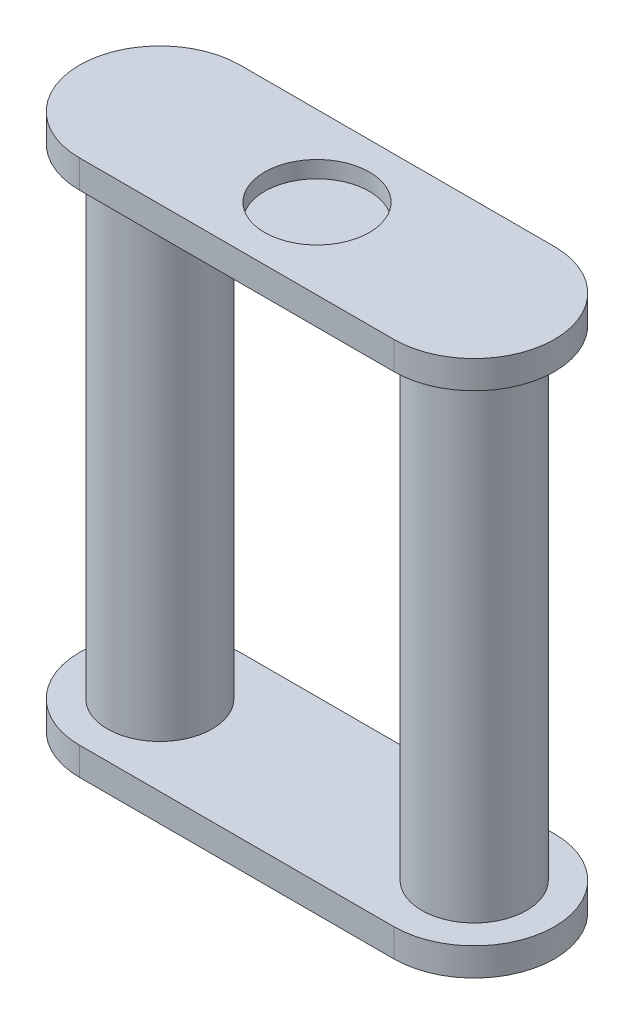
ISO-10303-21;
HEADER;
FILE_DESCRIPTION(('STEP AP214'),'2;1');
FILE_NAME('part.step','',(''),(''),'','','');
FILE_SCHEMA(('AUTOMOTIVE_DESIGN { 1 0 10303 214 1 1 1 1 }'));
ENDSEC;
DATA;
#1=APPLICATION_CONTEXT('core data for automotive mechanical design processes');
#2=APPLICATION_PROTOCOL_DEFINITION('international standard','automotive_design',2000,#1);
#3=PRODUCT_CONTEXT('',#1,'mechanical');
#4=PRODUCT('Part','Part','',(#3));
#5=PRODUCT_RELATED_PRODUCT_CATEGORY('part','',(#4));
#6=PRODUCT_DEFINITION_FORMATION('','',#4);
#7=PRODUCT_DEFINITION_CONTEXT('part definition',#1,'design');
#8=PRODUCT_DEFINITION('design','',#6,#7);
#9=PRODUCT_DEFINITION_SHAPE('','',#8);
#10=(LENGTH_UNIT() NAMED_UNIT(*) SI_UNIT(.MILLI.,.METRE.));
#11=(NAMED_UNIT(*) PLANE_ANGLE_UNIT() SI_UNIT($,.RADIAN.));
#12=(NAMED_UNIT(*) SI_UNIT($,.STERADIAN.) SOLID_ANGLE_UNIT());
#13=UNCERTAINTY_MEASURE_WITH_UNIT(LENGTH_MEASURE(1.E-05),#10,'distance_accuracy_value','');
#14=(GEOMETRIC_REPRESENTATION_CONTEXT(3) GLOBAL_UNCERTAINTY_ASSIGNED_CONTEXT((#13)) GLOBAL_UNIT_ASSIGNED_CONTEXT((#10,
#11,#12)) REPRESENTATION_CONTEXT('',''));
#15=CARTESIAN_POINT('',(0.,0.,0.));
#16=DIRECTION('',(0.,0.,1.));
#17=DIRECTION('',(1.,0.,0.));
#18=AXIS2_PLACEMENT_3D('',#15,#16,#17);
#19=CARTESIAN_POINT('',(0.,40.,-115.));
#20=DIRECTION('',(0.,-1.,0.));
#21=DIRECTION('',(0.,0.,-1.));
#22=AXIS2_PLACEMENT_3D('',#19,#20,#21);
#23=CYLINDRICAL_SURFACE('',#22,115.);
#24=CARTESIAN_POINT('',(0.,0.,-115.));
#25=DIRECTION('',(0.,1.,0.));
#26=DIRECTION('',(0.,0.,1.));
#27=AXIS2_PLACEMENT_3D('',#24,#25,#26);
#28=CIRCLE('',#27,115.);
#29=CARTESIAN_POINT('',(0.,0.,-230.));
#30=VERTEX_POINT('',#29);
#31=CARTESIAN_POINT('',(0.,0.,0.));
#32=VERTEX_POINT('',#31);
#33=EDGE_CURVE('E165',#30,#32,#28,.T.);
#34=ORIENTED_EDGE('',*,*,#33,.T.);
#35=DIRECTION('',(0.,-1.,0.));
#36=VECTOR('',#35,1.);
#37=CARTESIAN_POINT('',(0.,40.,0.));
#38=LINE('',#37,#36);
#39=CARTESIAN_POINT('',(0.,40.,0.));
#40=VERTEX_POINT('',#39);
#41=EDGE_CURVE('E11',#40,#32,#38,.T.);
#42=ORIENTED_EDGE('',*,*,#41,.F.);
#43=CARTESIAN_POINT('',(0.,40.,-115.));
#44=DIRECTION('',(0.,1.,0.));
#45=DIRECTION('',(0.,0.,1.));
#46=AXIS2_PLACEMENT_3D('',#43,#44,#45);
#47=CIRCLE('',#46,115.);
#48=CARTESIAN_POINT('',(0.,40.,-230.));
#49=VERTEX_POINT('',#48);
#50=EDGE_CURVE('E168',#49,#40,#47,.T.);
#51=ORIENTED_EDGE('',*,*,#50,.F.);
#52=DIRECTION('',(0.,-1.,0.));
#53=VECTOR('',#52,1.);
#54=CARTESIAN_POINT('',(0.,40.,-230.));
#55=LINE('',#54,#53);
#56=EDGE_CURVE('E174',#49,#30,#55,.T.);
#57=ORIENTED_EDGE('',*,*,#56,.T.);
#58=EDGE_LOOP('',(#34,#42,#51,#57));
#59=FACE_BOUND('',#58,.T.);
#60=ADVANCED_FACE('F37',(#59),#23,.T.);
#61=CARTESIAN_POINT('',(0.,40.,0.));
#62=DIRECTION('',(0.,0.,-1.));
#63=DIRECTION('',(-1.,0.,0.));
#64=AXIS2_PLACEMENT_3D('',#61,#62,#63);
#65=PLANE('',#64);
#66=DIRECTION('',(1.,0.,0.));
#67=VECTOR('',#66,1.);
#68=CARTESIAN_POINT('',(0.,0.,0.));
#69=LINE('',#68,#67);
#70=CARTESIAN_POINT('',(450.,0.,0.));
#71=VERTEX_POINT('',#70);
#72=EDGE_CURVE('E177',#32,#71,#69,.T.);
#73=ORIENTED_EDGE('',*,*,#72,.T.);
#74=DIRECTION('',(0.,-1.,0.));
#75=VECTOR('',#74,1.);
#76=CARTESIAN_POINT('',(450.,40.,0.));
#77=LINE('',#76,#75);
#78=CARTESIAN_POINT('',(450.,40.,0.));
#79=VERTEX_POINT('',#78);
#80=EDGE_CURVE('E45',#79,#71,#77,.T.);
#81=ORIENTED_EDGE('',*,*,#80,.F.);
#82=DIRECTION('',(1.,0.,0.));
#83=VECTOR('',#82,1.);
#84=CARTESIAN_POINT('',(0.,40.,0.));
#85=LINE('',#84,#83);
#86=EDGE_CURVE('E84',#40,#79,#85,.T.);
#87=ORIENTED_EDGE('',*,*,#86,.F.);
#88=ORIENTED_EDGE('',*,*,#41,.T.);
#89=EDGE_LOOP('',(#73,#81,#87,#88));
#90=FACE_BOUND('',#89,.T.);
#91=ADVANCED_FACE('F201',(#90),#65,.F.);
#92=CARTESIAN_POINT('',(450.,40.,-115.));
#93=DIRECTION('',(0.,-1.,0.));
#94=DIRECTION('',(0.,0.,-1.));
#95=AXIS2_PLACEMENT_3D('',#92,#93,#94);
#96=CYLINDRICAL_SURFACE('',#95,115.);
#97=CARTESIAN_POINT('',(450.,0.,-115.));
#98=DIRECTION('',(0.,1.,0.));
#99=DIRECTION('',(0.,0.,1.));
#100=AXIS2_PLACEMENT_3D('',#97,#98,#99);
#101=CIRCLE('',#100,115.);
#102=CARTESIAN_POINT('',(450.,0.,-230.));
#103=VERTEX_POINT('',#102);
#104=EDGE_CURVE('E71',#71,#103,#101,.T.);
#105=ORIENTED_EDGE('',*,*,#104,.T.);
#106=DIRECTION('',(0.,-1.,0.));
#107=VECTOR('',#106,1.);
#108=CARTESIAN_POINT('',(450.,40.,-230.));
#109=LINE('',#108,#107);
#110=CARTESIAN_POINT('',(450.,40.,-230.));
#111=VERTEX_POINT('',#110);
#112=EDGE_CURVE('E182',#111,#103,#109,.T.);
#113=ORIENTED_EDGE('',*,*,#112,.F.);
#114=CARTESIAN_POINT('',(450.,40.,-115.));
#115=DIRECTION('',(0.,1.,0.));
#116=DIRECTION('',(0.,0.,1.));
#117=AXIS2_PLACEMENT_3D('',#114,#115,#116);
#118=CIRCLE('',#117,115.);
#119=EDGE_CURVE('E171',#79,#111,#118,.T.);
#120=ORIENTED_EDGE('',*,*,#119,.F.);
#121=ORIENTED_EDGE('',*,*,#80,.T.);
#122=EDGE_LOOP('',(#105,#113,#120,#121));
#123=FACE_BOUND('',#122,.T.);
#124=ADVANCED_FACE('F184',(#123),#96,.T.);
#125=CARTESIAN_POINT('',(0.,40.,-230.));
#126=DIRECTION('',(0.,0.,1.));
#127=DIRECTION('',(1.,0.,0.));
#128=AXIS2_PLACEMENT_3D('',#125,#126,#127);
#129=PLANE('',#128);
#130=DIRECTION('',(-1.,0.,0.));
#131=VECTOR('',#130,1.);
#132=CARTESIAN_POINT('',(0.,0.,-230.));
#133=LINE('',#132,#131);
#134=EDGE_CURVE('E77',#103,#30,#133,.T.);
#135=ORIENTED_EDGE('',*,*,#134,.T.);
#136=ORIENTED_EDGE('',*,*,#56,.F.);
#137=DIRECTION('',(-1.,0.,0.));
#138=VECTOR('',#137,1.);
#139=CARTESIAN_POINT('',(0.,40.,-230.));
#140=LINE('',#139,#138);
#141=EDGE_CURVE('E53',#111,#49,#140,.T.);
#142=ORIENTED_EDGE('',*,*,#141,.F.);
#143=ORIENTED_EDGE('',*,*,#112,.T.);
#144=EDGE_LOOP('',(#135,#136,#142,#143));
#145=FACE_BOUND('',#144,.T.);
#146=ADVANCED_FACE('F191',(#145),#129,.F.);
#147=CARTESIAN_POINT('',(0.,40.,-115.));
#148=DIRECTION('',(0.,1.,0.));
#149=DIRECTION('',(0.,0.,1.));
#150=AXIS2_PLACEMENT_3D('',#147,#148,#149);
#151=PLANE('',#150);
#152=CARTESIAN_POINT('',(450.,40.,-115.));
#153=DIRECTION('',(0.,1.,0.));
#154=DIRECTION('',(0.,0.,1.));
#155=AXIS2_PLACEMENT_3D('',#152,#153,#154);
#156=CIRCLE('',#155,75.);
#157=CARTESIAN_POINT('',(450.,40.,-40.));
#158=VERTEX_POINT('',#157);
#159=EDGE_CURVE('E122',#158,#158,#156,.T.);
#160=ORIENTED_EDGE('',*,*,#159,.F.);
#161=EDGE_LOOP('',(#160));
#162=FACE_BOUND('',#161,.T.);
#163=CARTESIAN_POINT('',(0.,40.,-115.));
#164=DIRECTION('',(0.,1.,0.));
#165=DIRECTION('',(0.,0.,1.));
#166=AXIS2_PLACEMENT_3D('',#163,#164,#165);
#167=CIRCLE('',#166,75.);
#168=CARTESIAN_POINT('',(0.,40.,-40.));
#169=VERTEX_POINT('',#168);
#170=EDGE_CURVE('E159',#169,#169,#167,.T.);
#171=ORIENTED_EDGE('',*,*,#170,.F.);
#172=EDGE_LOOP('',(#171));
#173=FACE_BOUND('',#172,.T.);
#174=ORIENTED_EDGE('',*,*,#50,.T.);
#175=ORIENTED_EDGE('',*,*,#86,.T.);
#176=ORIENTED_EDGE('',*,*,#119,.T.);
#177=ORIENTED_EDGE('',*,*,#141,.T.);
#178=EDGE_LOOP('',(#174,#175,#176,#177));
#179=FACE_BOUND('',#178,.T.);
#180=ADVANCED_FACE('F193',(#162,#173,#179),#151,.T.);
#181=CARTESIAN_POINT('',(0.,0.,-115.));
#182=DIRECTION('',(0.,1.,0.));
#183=DIRECTION('',(0.,0.,1.));
#184=AXIS2_PLACEMENT_3D('',#181,#182,#183);
#185=PLANE('',#184);
#186=CARTESIAN_POINT('',(225.,0.,-115.));
#187=DIRECTION('',(0.,1.,0.));
#188=DIRECTION('',(0.,0.,1.));
#189=AXIS2_PLACEMENT_3D('',#186,#187,#188);
#190=CIRCLE('',#189,75.);
#191=CARTESIAN_POINT('',(225.,0.,-40.));
#192=VERTEX_POINT('',#191);
#193=EDGE_CURVE('E354',#192,#192,#190,.F.);
#194=ORIENTED_EDGE('',*,*,#193,.F.);
#195=EDGE_LOOP('',(#194));
#196=FACE_BOUND('',#195,.T.);
#197=ORIENTED_EDGE('',*,*,#33,.F.);
#198=ORIENTED_EDGE('',*,*,#134,.F.);
#199=ORIENTED_EDGE('',*,*,#104,.F.);
#200=ORIENTED_EDGE('',*,*,#72,.F.);
#201=EDGE_LOOP('',(#197,#198,#199,#200));
#202=FACE_BOUND('',#201,.T.);
#203=ADVANCED_FACE('F187',(#196,#202),#185,.F.);
#204=CARTESIAN_POINT('',(0.,728.,-115.));
#205=DIRECTION('',(0.,-1.,0.));
#206=DIRECTION('',(0.,0.,-1.));
#207=AXIS2_PLACEMENT_3D('',#204,#205,#206);
#208=CYLINDRICAL_SURFACE('',#207,75.);
#209=CARTESIAN_POINT('',(0.,728.,-115.));
#210=DIRECTION('',(0.,1.,0.));
#211=DIRECTION('',(0.,0.,1.));
#212=AXIS2_PLACEMENT_3D('',#209,#210,#211);
#213=CIRCLE('',#212,75.);
#214=CARTESIAN_POINT('',(0.,728.,-40.));
#215=VERTEX_POINT('',#214);
#216=EDGE_CURVE('E162',#215,#215,#213,.T.);
#217=ORIENTED_EDGE('',*,*,#216,.F.);
#218=EDGE_LOOP('',(#217));
#219=FACE_BOUND('',#218,.T.);
#220=ORIENTED_EDGE('',*,*,#170,.T.);
#221=EDGE_LOOP('',(#220));
#222=FACE_BOUND('',#221,.T.);
#223=ADVANCED_FACE('F231',(#219,#222),#208,.T.);
#224=CARTESIAN_POINT('',(450.,728.,-115.));
#225=DIRECTION('',(0.,-1.,0.));
#226=DIRECTION('',(0.,0.,-1.));
#227=AXIS2_PLACEMENT_3D('',#224,#225,#226);
#228=CYLINDRICAL_SURFACE('',#227,75.);
#229=CARTESIAN_POINT('',(450.,728.,-115.));
#230=DIRECTION('',(0.,1.,0.));
#231=DIRECTION('',(0.,0.,1.));
#232=AXIS2_PLACEMENT_3D('',#229,#230,#231);
#233=CIRCLE('',#232,75.);
#234=CARTESIAN_POINT('',(450.,728.,-40.));
#235=VERTEX_POINT('',#234);
#236=EDGE_CURVE('E156',#235,#235,#233,.T.);
#237=ORIENTED_EDGE('',*,*,#236,.F.);
#238=EDGE_LOOP('',(#237));
#239=FACE_BOUND('',#238,.T.);
#240=ORIENTED_EDGE('',*,*,#159,.T.);
#241=EDGE_LOOP('',(#240));
#242=FACE_BOUND('',#241,.T.);
#243=ADVANCED_FACE('F236',(#239,#242),#228,.T.);
#244=CARTESIAN_POINT('',(0.,728.,-115.));
#245=DIRECTION('',(0.,1.,0.));
#246=DIRECTION('',(0.,0.,1.));
#247=AXIS2_PLACEMENT_3D('',#244,#245,#246);
#248=CYLINDRICAL_SURFACE('',#247,115.);
#249=CARTESIAN_POINT('',(0.,768.,-115.));
#250=DIRECTION('',(0.,1.,0.));
#251=DIRECTION('',(0.,0.,1.));
#252=AXIS2_PLACEMENT_3D('',#249,#250,#251);
#253=CIRCLE('',#252,115.);
#254=CARTESIAN_POINT('',(0.,768.,-230.));
#255=VERTEX_POINT('',#254);
#256=CARTESIAN_POINT('',(0.,768.,0.));
#257=VERTEX_POINT('',#256);
#258=EDGE_CURVE('E117',#255,#257,#253,.T.);
#259=ORIENTED_EDGE('',*,*,#258,.F.);
#260=DIRECTION('',(0.,1.,0.));
#261=VECTOR('',#260,1.);
#262=CARTESIAN_POINT('',(0.,728.,-230.));
#263=LINE('',#262,#261);
#264=CARTESIAN_POINT('',(0.,728.,-230.));
#265=VERTEX_POINT('',#264);
#266=EDGE_CURVE('E111',#265,#255,#263,.T.);
#267=ORIENTED_EDGE('',*,*,#266,.F.);
#268=CARTESIAN_POINT('',(0.,728.,-115.));
#269=DIRECTION('',(0.,1.,0.));
#270=DIRECTION('',(0.,0.,1.));
#271=AXIS2_PLACEMENT_3D('',#268,#269,#270);
#272=CIRCLE('',#271,115.);
#273=CARTESIAN_POINT('',(0.,728.,0.));
#274=VERTEX_POINT('',#273);
#275=EDGE_CURVE('E114',#265,#274,#272,.T.);
#276=ORIENTED_EDGE('',*,*,#275,.T.);
#277=DIRECTION('',(0.,1.,0.));
#278=VECTOR('',#277,1.);
#279=CARTESIAN_POINT('',(0.,728.,0.));
#280=LINE('',#279,#278);
#281=EDGE_CURVE('E142',#274,#257,#280,.T.);
#282=ORIENTED_EDGE('',*,*,#281,.T.);
#283=EDGE_LOOP('',(#259,#267,#276,#282));
#284=FACE_BOUND('',#283,.T.);
#285=ADVANCED_FACE('F113',(#284),#248,.T.);
#286=CARTESIAN_POINT('',(0.,728.,-230.));
#287=DIRECTION('',(0.,0.,-1.));
#288=DIRECTION('',(-1.,0.,0.));
#289=AXIS2_PLACEMENT_3D('',#286,#287,#288);
#290=PLANE('',#289);
#291=DIRECTION('',(-1.,0.,0.));
#292=VECTOR('',#291,1.);
#293=CARTESIAN_POINT('',(0.,768.,-230.));
#294=LINE('',#293,#292);
#295=CARTESIAN_POINT('',(450.,768.,-230.));
#296=VERTEX_POINT('',#295);
#297=EDGE_CURVE('E144',#296,#255,#294,.T.);
#298=ORIENTED_EDGE('',*,*,#297,.F.);
#299=DIRECTION('',(0.,1.,0.));
#300=VECTOR('',#299,1.);
#301=CARTESIAN_POINT('',(450.,728.,-230.));
#302=LINE('',#301,#300);
#303=CARTESIAN_POINT('',(450.,728.,-230.));
#304=VERTEX_POINT('',#303);
#305=EDGE_CURVE('E123',#304,#296,#302,.T.);
#306=ORIENTED_EDGE('',*,*,#305,.F.);
#307=DIRECTION('',(-1.,0.,0.));
#308=VECTOR('',#307,1.);
#309=CARTESIAN_POINT('',(0.,728.,-230.));
#310=LINE('',#309,#308);
#311=EDGE_CURVE('E129',#304,#265,#310,.T.);
#312=ORIENTED_EDGE('',*,*,#311,.T.);
#313=ORIENTED_EDGE('',*,*,#266,.T.);
#314=EDGE_LOOP('',(#298,#306,#312,#313));
#315=FACE_BOUND('',#314,.T.);
#316=ADVANCED_FACE('F135',(#315),#290,.T.);
#317=CARTESIAN_POINT('',(450.,728.,-115.));
#318=DIRECTION('',(0.,1.,0.));
#319=DIRECTION('',(0.,0.,1.));
#320=AXIS2_PLACEMENT_3D('',#317,#318,#319);
#321=CYLINDRICAL_SURFACE('',#320,115.);
#322=CARTESIAN_POINT('',(450.,768.,-115.));
#323=DIRECTION('',(0.,1.,0.));
#324=DIRECTION('',(0.,0.,1.));
#325=AXIS2_PLACEMENT_3D('',#322,#323,#324);
#326=CIRCLE('',#325,115.);
#327=CARTESIAN_POINT('',(450.,768.,0.));
#328=VERTEX_POINT('',#327);
#329=EDGE_CURVE('E147',#328,#296,#326,.T.);
#330=ORIENTED_EDGE('',*,*,#329,.F.);
#331=DIRECTION('',(0.,1.,0.));
#332=VECTOR('',#331,1.);
#333=CARTESIAN_POINT('',(450.,728.,0.));
#334=LINE('',#333,#332);
#335=CARTESIAN_POINT('',(450.,728.,0.));
#336=VERTEX_POINT('',#335);
#337=EDGE_CURVE('E153',#336,#328,#334,.T.);
#338=ORIENTED_EDGE('',*,*,#337,.F.);
#339=CARTESIAN_POINT('',(450.,728.,-115.));
#340=DIRECTION('',(0.,1.,0.));
#341=DIRECTION('',(0.,0.,1.));
#342=AXIS2_PLACEMENT_3D('',#339,#340,#341);
#343=CIRCLE('',#342,115.);
#344=EDGE_CURVE('E136',#336,#304,#343,.T.);
#345=ORIENTED_EDGE('',*,*,#344,.T.);
#346=ORIENTED_EDGE('',*,*,#305,.T.);
#347=EDGE_LOOP('',(#330,#338,#345,#346));
#348=FACE_BOUND('',#347,.T.);
#349=ADVANCED_FACE('F263',(#348),#321,.T.);
#350=CARTESIAN_POINT('',(0.,728.,0.));
#351=DIRECTION('',(0.,0.,1.));
#352=DIRECTION('',(1.,0.,0.));
#353=AXIS2_PLACEMENT_3D('',#350,#351,#352);
#354=PLANE('',#353);
#355=DIRECTION('',(1.,0.,0.));
#356=VECTOR('',#355,1.);
#357=CARTESIAN_POINT('',(0.,768.,0.));
#358=LINE('',#357,#356);
#359=EDGE_CURVE('E133',#257,#328,#358,.T.);
#360=ORIENTED_EDGE('',*,*,#359,.F.);
#361=ORIENTED_EDGE('',*,*,#281,.F.);
#362=DIRECTION('',(1.,0.,0.));
#363=VECTOR('',#362,1.);
#364=CARTESIAN_POINT('',(0.,728.,0.));
#365=LINE('',#364,#363);
#366=EDGE_CURVE('E132',#274,#336,#365,.T.);
#367=ORIENTED_EDGE('',*,*,#366,.T.);
#368=ORIENTED_EDGE('',*,*,#337,.T.);
#369=EDGE_LOOP('',(#360,#361,#367,#368));
#370=FACE_BOUND('',#369,.T.);
#371=ADVANCED_FACE('F272',(#370),#354,.T.);
#372=CARTESIAN_POINT('',(0.,728.,-115.));
#373=DIRECTION('',(0.,-1.,0.));
#374=DIRECTION('',(0.,0.,1.));
#375=AXIS2_PLACEMENT_3D('',#372,#373,#374);
#376=PLANE('',#375);
#377=ORIENTED_EDGE('',*,*,#216,.T.);
#378=EDGE_LOOP('',(#377));
#379=FACE_BOUND('',#378,.T.);
#380=ORIENTED_EDGE('',*,*,#236,.T.);
#381=EDGE_LOOP('',(#380));
#382=FACE_BOUND('',#381,.T.);
#383=ORIENTED_EDGE('',*,*,#275,.F.);
#384=ORIENTED_EDGE('',*,*,#311,.F.);
#385=ORIENTED_EDGE('',*,*,#344,.F.);
#386=ORIENTED_EDGE('',*,*,#366,.F.);
#387=EDGE_LOOP('',(#383,#384,#385,#386));
#388=FACE_BOUND('',#387,.T.);
#389=ADVANCED_FACE('F127',(#379,#382,#388),#376,.T.);
#390=CARTESIAN_POINT('',(0.,768.,-115.));
#391=DIRECTION('',(0.,-1.,0.));
#392=DIRECTION('',(0.,0.,1.));
#393=AXIS2_PLACEMENT_3D('',#390,#391,#392);
#394=PLANE('',#393);
#395=CARTESIAN_POINT('',(225.,768.,-115.));
#396=DIRECTION('',(0.,-1.,0.));
#397=DIRECTION('',(0.,0.,-1.));
#398=AXIS2_PLACEMENT_3D('',#395,#396,#397);
#399=CIRCLE('',#398,75.);
#400=CARTESIAN_POINT('',(225.,768.,-190.));
#401=VERTEX_POINT('',#400);
#402=EDGE_CURVE('E145',#401,#401,#399,.T.);
#403=ORIENTED_EDGE('',*,*,#402,.T.);
#404=EDGE_LOOP('',(#403));
#405=FACE_BOUND('',#404,.T.);
#406=ORIENTED_EDGE('',*,*,#258,.T.);
#407=ORIENTED_EDGE('',*,*,#359,.T.);
#408=ORIENTED_EDGE('',*,*,#329,.T.);
#409=ORIENTED_EDGE('',*,*,#297,.T.);
#410=EDGE_LOOP('',(#406,#407,#408,#409));
#411=FACE_BOUND('',#410,.T.);
#412=ADVANCED_FACE('F291',(#405,#411),#394,.F.);
#413=CARTESIAN_POINT('',(225.,744.,-115.));
#414=DIRECTION('',(0.,1.,0.));
#415=DIRECTION('',(0.,0.,1.));
#416=AXIS2_PLACEMENT_3D('',#413,#414,#415);
#417=CYLINDRICAL_SURFACE('',#416,75.);
#418=CARTESIAN_POINT('',(225.,744.,-115.));
#419=DIRECTION('',(0.,1.,0.));
#420=DIRECTION('',(0.,0.,1.));
#421=AXIS2_PLACEMENT_3D('',#418,#419,#420);
#422=CIRCLE('',#421,75.);
#423=CARTESIAN_POINT('',(225.,744.,-40.));
#424=VERTEX_POINT('',#423);
#425=EDGE_CURVE('E357',#424,#424,#422,.T.);
#426=ORIENTED_EDGE('',*,*,#425,.F.);
#427=EDGE_LOOP('',(#426));
#428=FACE_BOUND('',#427,.T.);
#429=ORIENTED_EDGE('',*,*,#402,.F.);
#430=EDGE_LOOP('',(#429));
#431=FACE_BOUND('',#430,.T.);
#432=ADVANCED_FACE('F301',(#428,#431),#417,.F.);
#433=CARTESIAN_POINT('',(225.,744.,-115.));
#434=DIRECTION('',(0.,1.,0.));
#435=DIRECTION('',(0.,0.,1.));
#436=AXIS2_PLACEMENT_3D('',#433,#434,#435);
#437=PLANE('',#436);
#438=ORIENTED_EDGE('',*,*,#425,.T.);
#439=EDGE_LOOP('',(#438));
#440=FACE_BOUND('',#439,.T.);
#441=ADVANCED_FACE('F317',(#440),#437,.T.);
#442=CARTESIAN_POINT('',(225.,24.,-115.));
#443=DIRECTION('',(0.,-1.,0.));
#444=DIRECTION('',(0.,0.,-1.));
#445=AXIS2_PLACEMENT_3D('',#442,#443,#444);
#446=CYLINDRICAL_SURFACE('',#445,75.);
#447=CARTESIAN_POINT('',(225.,24.,-115.));
#448=DIRECTION('',(0.,1.,0.));
#449=DIRECTION('',(0.,0.,1.));
#450=AXIS2_PLACEMENT_3D('',#447,#448,#449);
#451=CIRCLE('',#450,75.);
#452=CARTESIAN_POINT('',(225.,24.,-40.));
#453=VERTEX_POINT('',#452);
#454=EDGE_CURVE('E353',#453,#453,#451,.T.);
#455=ORIENTED_EDGE('',*,*,#454,.T.);
#456=EDGE_LOOP('',(#455));
#457=FACE_BOUND('',#456,.T.);
#458=ORIENTED_EDGE('',*,*,#193,.T.);
#459=EDGE_LOOP('',(#458));
#460=FACE_BOUND('',#459,.T.);
#461=ADVANCED_FACE('F327',(#457,#460),#446,.F.);
#462=CARTESIAN_POINT('',(225.,24.,-115.));
#463=DIRECTION('',(0.,-1.,0.));
#464=DIRECTION('',(0.,0.,1.));
#465=AXIS2_PLACEMENT_3D('',#462,#463,#464);
#466=PLANE('',#465);
#467=ORIENTED_EDGE('',*,*,#454,.F.);
#468=EDGE_LOOP('',(#467));
#469=FACE_BOUND('',#468,.T.);
#470=ADVANCED_FACE('F337',(#469),#466,.T.);
#471=CLOSED_SHELL('',(#60,#91,#124,#146,#180,#203,#223,#243,#285,#316,#349,#371,#389,#412,#432,
#441,#461,#470));
#472=MANIFOLD_SOLID_BREP('B2',#471);
#473=ADVANCED_BREP_SHAPE_REPRESENTATION('',(#18,#472),#14);
#474=SHAPE_DEFINITION_REPRESENTATION(#9,#473);
ENDSEC;
END-ISO-10303-21;
